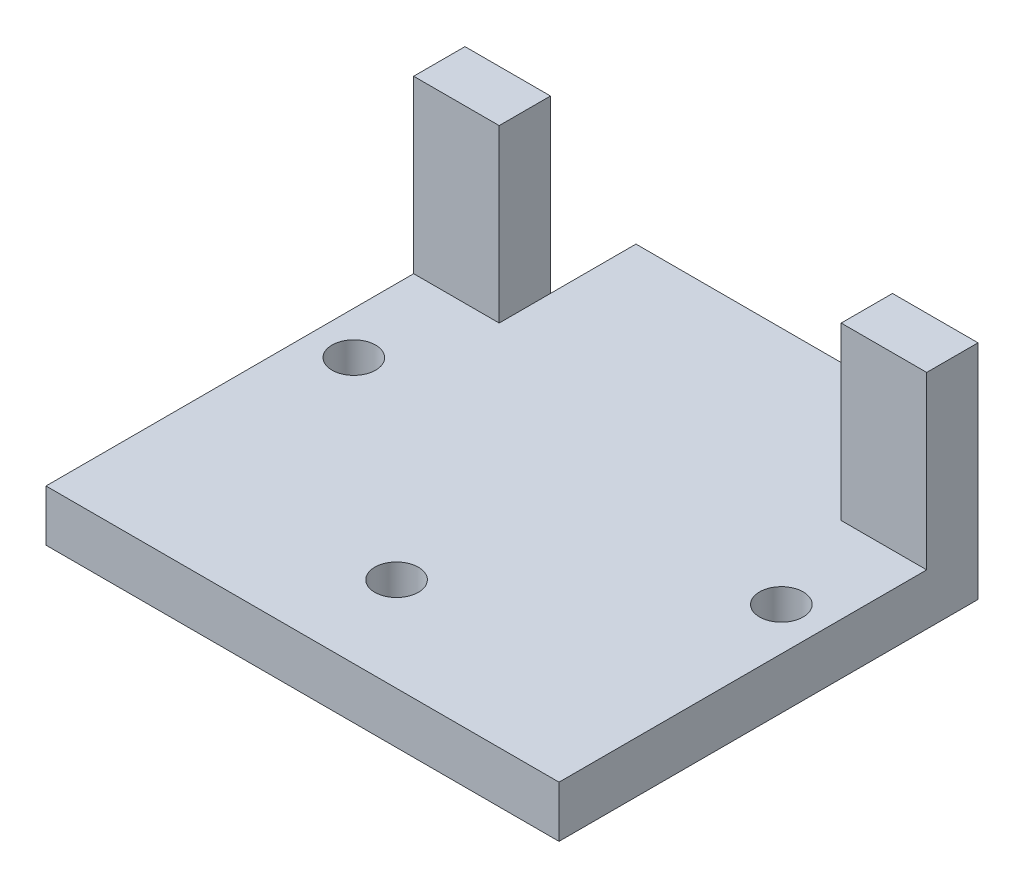
ISO-10303-21;
HEADER;
FILE_DESCRIPTION(('STEP AP214'),'2;1');
FILE_NAME('part.step','',(''),(''),'','','');
FILE_SCHEMA(('AUTOMOTIVE_DESIGN { 1 0 10303 214 1 1 1 1 }'));
ENDSEC;
DATA;
#1=APPLICATION_CONTEXT('core data for automotive mechanical design processes');
#2=APPLICATION_PROTOCOL_DEFINITION('international standard','automotive_design',2000,#1);
#3=PRODUCT_CONTEXT('',#1,'mechanical');
#4=PRODUCT('Part','Part','',(#3));
#5=PRODUCT_RELATED_PRODUCT_CATEGORY('part','',(#4));
#6=PRODUCT_DEFINITION_FORMATION('','',#4);
#7=PRODUCT_DEFINITION_CONTEXT('part definition',#1,'design');
#8=PRODUCT_DEFINITION('design','',#6,#7);
#9=PRODUCT_DEFINITION_SHAPE('','',#8);
#10=(LENGTH_UNIT() NAMED_UNIT(*) SI_UNIT(.MILLI.,.METRE.));
#11=(NAMED_UNIT(*) PLANE_ANGLE_UNIT() SI_UNIT($,.RADIAN.));
#12=(NAMED_UNIT(*) SI_UNIT($,.STERADIAN.) SOLID_ANGLE_UNIT());
#13=UNCERTAINTY_MEASURE_WITH_UNIT(LENGTH_MEASURE(1.E-05),#10,'distance_accuracy_value','');
#14=(GEOMETRIC_REPRESENTATION_CONTEXT(3) GLOBAL_UNCERTAINTY_ASSIGNED_CONTEXT((#13)) GLOBAL_UNIT_ASSIGNED_CONTEXT((#10,
#11,#12)) REPRESENTATION_CONTEXT('',''));
#15=CARTESIAN_POINT('',(0.,0.,0.));
#16=DIRECTION('',(0.,0.,1.));
#17=DIRECTION('',(1.,0.,0.));
#18=AXIS2_PLACEMENT_3D('',#15,#16,#17);
#19=CARTESIAN_POINT('',(0.,6.,0.));
#20=DIRECTION('',(0.,-1.,0.));
#21=DIRECTION('',(0.,0.,-1.));
#22=AXIS2_PLACEMENT_3D('',#19,#20,#21);
#23=PLANE('',#22);
#24=CARTESIAN_POINT('',(0.,6.,29.));
#25=DIRECTION('',(0.,1.,0.));
#26=DIRECTION('',(0.,0.,1.));
#27=AXIS2_PLACEMENT_3D('',#24,#25,#26);
#28=CIRCLE('',#27,2.55);
#29=CARTESIAN_POINT('',(0.,6.,31.55));
#30=VERTEX_POINT('',#29);
#31=EDGE_CURVE('E191',#30,#30,#28,.T.);
#32=ORIENTED_EDGE('',*,*,#31,.F.);
#33=EDGE_LOOP('',(#32));
#34=FACE_BOUND('',#33,.T.);
#35=CARTESIAN_POINT('',(-25.,6.,9.));
#36=DIRECTION('',(0.,1.,0.));
#37=DIRECTION('',(0.,0.,1.));
#38=AXIS2_PLACEMENT_3D('',#35,#36,#37);
#39=CIRCLE('',#38,2.55);
#40=CARTESIAN_POINT('',(-25.,6.,11.55));
#41=VERTEX_POINT('',#40);
#42=EDGE_CURVE('E465',#41,#41,#39,.T.);
#43=ORIENTED_EDGE('',*,*,#42,.F.);
#44=EDGE_LOOP('',(#43));
#45=FACE_BOUND('',#44,.T.);
#46=CARTESIAN_POINT('',(25.,6.,9.));
#47=DIRECTION('',(0.,1.,0.));
#48=DIRECTION('',(0.,0.,1.));
#49=AXIS2_PLACEMENT_3D('',#46,#47,#48);
#50=CIRCLE('',#49,2.55);
#51=CARTESIAN_POINT('',(25.,6.,11.55));
#52=VERTEX_POINT('',#51);
#53=EDGE_CURVE('E222',#52,#52,#50,.T.);
#54=ORIENTED_EDGE('',*,*,#53,.F.);
#55=EDGE_LOOP('',(#54));
#56=FACE_BOUND('',#55,.T.);
#57=DIRECTION('',(0.,0.,-1.));
#58=VECTOR('',#57,1.);
#59=CARTESIAN_POINT('',(-20.,6.,-3.));
#60=LINE('',#59,#58);
#61=CARTESIAN_POINT('',(-20.,6.,-3.));
#62=VERTEX_POINT('',#61);
#63=CARTESIAN_POINT('',(-20.,6.,-9.));
#64=VERTEX_POINT('',#63);
#65=EDGE_CURVE('E156',#62,#64,#60,.T.);
#66=ORIENTED_EDGE('',*,*,#65,.F.);
#67=DIRECTION('',(1.,0.,0.));
#68=VECTOR('',#67,1.);
#69=CARTESIAN_POINT('',(-30.,6.,-3.));
#70=LINE('',#69,#68);
#71=CARTESIAN_POINT('',(-30.,6.,-3.));
#72=VERTEX_POINT('',#71);
#73=EDGE_CURVE('E152',#72,#62,#70,.T.);
#74=ORIENTED_EDGE('',*,*,#73,.F.);
#75=DIRECTION('',(0.,0.,1.));
#76=VECTOR('',#75,1.);
#77=CARTESIAN_POINT('',(-30.,6.,40.));
#78=LINE('',#77,#76);
#79=CARTESIAN_POINT('',(-30.,6.,40.));
#80=VERTEX_POINT('',#79);
#81=EDGE_CURVE('E237',#72,#80,#78,.T.);
#82=ORIENTED_EDGE('',*,*,#81,.T.);
#83=DIRECTION('',(1.,0.,0.));
#84=VECTOR('',#83,1.);
#85=CARTESIAN_POINT('',(-30.,6.,40.));
#86=LINE('',#85,#84);
#87=CARTESIAN_POINT('',(30.,6.,40.));
#88=VERTEX_POINT('',#87);
#89=EDGE_CURVE('E239',#80,#88,#86,.T.);
#90=ORIENTED_EDGE('',*,*,#89,.T.);
#91=DIRECTION('',(0.,0.,-1.));
#92=VECTOR('',#91,1.);
#93=CARTESIAN_POINT('',(30.,6.,40.));
#94=LINE('',#93,#92);
#95=CARTESIAN_POINT('',(30.,6.,-3.));
#96=VERTEX_POINT('',#95);
#97=EDGE_CURVE('E182',#88,#96,#94,.T.);
#98=ORIENTED_EDGE('',*,*,#97,.T.);
#99=DIRECTION('',(1.,0.,0.));
#100=VECTOR('',#99,1.);
#101=CARTESIAN_POINT('',(30.,6.,-3.));
#102=LINE('',#101,#100);
#103=CARTESIAN_POINT('',(20.,6.,-3.));
#104=VERTEX_POINT('',#103);
#105=EDGE_CURVE('E52',#104,#96,#102,.T.);
#106=ORIENTED_EDGE('',*,*,#105,.F.);
#107=DIRECTION('',(0.,0.,1.));
#108=VECTOR('',#107,1.);
#109=CARTESIAN_POINT('',(20.,6.,-3.));
#110=LINE('',#109,#108);
#111=CARTESIAN_POINT('',(20.,6.,-9.));
#112=VERTEX_POINT('',#111);
#113=EDGE_CURVE('E157',#112,#104,#110,.T.);
#114=ORIENTED_EDGE('',*,*,#113,.F.);
#115=DIRECTION('',(0.,0.,1.));
#116=VECTOR('',#115,1.);
#117=CARTESIAN_POINT('',(20.,6.,-9.));
#118=LINE('',#117,#116);
#119=CARTESIAN_POINT('',(20.,6.,-19.));
#120=VERTEX_POINT('',#119);
#121=EDGE_CURVE('E210',#120,#112,#118,.T.);
#122=ORIENTED_EDGE('',*,*,#121,.F.);
#123=DIRECTION('',(1.,0.,0.));
#124=VECTOR('',#123,1.);
#125=CARTESIAN_POINT('',(-20.,6.,-19.));
#126=LINE('',#125,#124);
#127=CARTESIAN_POINT('',(-20.,6.,-19.));
#128=VERTEX_POINT('',#127);
#129=EDGE_CURVE('E219',#128,#120,#126,.T.);
#130=ORIENTED_EDGE('',*,*,#129,.F.);
#131=DIRECTION('',(0.,0.,-1.));
#132=VECTOR('',#131,1.);
#133=CARTESIAN_POINT('',(-20.,6.,-9.));
#134=LINE('',#133,#132);
#135=EDGE_CURVE('E215',#64,#128,#134,.T.);
#136=ORIENTED_EDGE('',*,*,#135,.F.);
#137=EDGE_LOOP('',(#66,#74,#82,#90,#98,#106,#114,#122,#130,#136));
#138=FACE_BOUND('',#137,.T.);
#139=ADVANCED_FACE('F35',(#34,#45,#56,#138),#23,.F.);
#140=CARTESIAN_POINT('',(30.,6.,40.));
#141=DIRECTION('',(-1.,0.,0.));
#142=DIRECTION('',(0.,0.,1.));
#143=AXIS2_PLACEMENT_3D('',#140,#141,#142);
#144=PLANE('',#143);
#145=DIRECTION('',(0.,0.,-1.));
#146=VECTOR('',#145,1.);
#147=CARTESIAN_POINT('',(30.,0.,40.));
#148=LINE('',#147,#146);
#149=CARTESIAN_POINT('',(30.,0.,40.));
#150=VERTEX_POINT('',#149);
#151=CARTESIAN_POINT('',(30.,0.,-9.));
#152=VERTEX_POINT('',#151);
#153=EDGE_CURVE('E234',#150,#152,#148,.T.);
#154=ORIENTED_EDGE('',*,*,#153,.T.);
#155=DIRECTION('',(0.,1.,0.));
#156=VECTOR('',#155,1.);
#157=CARTESIAN_POINT('',(30.,6.,-9.));
#158=LINE('',#157,#156);
#159=CARTESIAN_POINT('',(30.,26.,-9.));
#160=VERTEX_POINT('',#159);
#161=EDGE_CURVE('E60',#152,#160,#158,.T.);
#162=ORIENTED_EDGE('',*,*,#161,.T.);
#163=DIRECTION('',(0.,0.,-1.));
#164=VECTOR('',#163,1.);
#165=CARTESIAN_POINT('',(30.,26.,-3.));
#166=LINE('',#165,#164);
#167=CARTESIAN_POINT('',(30.,26.,-3.));
#168=VERTEX_POINT('',#167);
#169=EDGE_CURVE('E171',#168,#160,#166,.T.);
#170=ORIENTED_EDGE('',*,*,#169,.F.);
#171=DIRECTION('',(0.,-1.,0.));
#172=VECTOR('',#171,1.);
#173=CARTESIAN_POINT('',(30.,26.,-3.));
#174=LINE('',#173,#172);
#175=EDGE_CURVE('E184',#168,#96,#174,.T.);
#176=ORIENTED_EDGE('',*,*,#175,.T.);
#177=ORIENTED_EDGE('',*,*,#97,.F.);
#178=DIRECTION('',(0.,-1.,0.));
#179=VECTOR('',#178,1.);
#180=CARTESIAN_POINT('',(30.,6.,40.));
#181=LINE('',#180,#179);
#182=EDGE_CURVE('E241',#88,#150,#181,.T.);
#183=ORIENTED_EDGE('',*,*,#182,.T.);
#184=EDGE_LOOP('',(#154,#162,#170,#176,#177,#183));
#185=FACE_BOUND('',#184,.T.);
#186=ADVANCED_FACE('F37',(#185),#144,.F.);
#187=CARTESIAN_POINT('',(-30.,6.,40.));
#188=DIRECTION('',(1.,0.,0.));
#189=DIRECTION('',(0.,0.,-1.));
#190=AXIS2_PLACEMENT_3D('',#187,#188,#189);
#191=PLANE('',#190);
#192=ORIENTED_EDGE('',*,*,#81,.F.);
#193=DIRECTION('',(0.,-1.,0.));
#194=VECTOR('',#193,1.);
#195=CARTESIAN_POINT('',(-30.,26.,-3.));
#196=LINE('',#195,#194);
#197=CARTESIAN_POINT('',(-30.,26.,-3.));
#198=VERTEX_POINT('',#197);
#199=EDGE_CURVE('E158',#198,#72,#196,.T.);
#200=ORIENTED_EDGE('',*,*,#199,.F.);
#201=DIRECTION('',(0.,0.,1.));
#202=VECTOR('',#201,1.);
#203=CARTESIAN_POINT('',(-30.,26.,-3.));
#204=LINE('',#203,#202);
#205=CARTESIAN_POINT('',(-30.,26.,-9.));
#206=VERTEX_POINT('',#205);
#207=EDGE_CURVE('E142',#206,#198,#204,.T.);
#208=ORIENTED_EDGE('',*,*,#207,.F.);
#209=DIRECTION('',(0.,-1.,0.));
#210=VECTOR('',#209,1.);
#211=CARTESIAN_POINT('',(-30.,6.,-9.));
#212=LINE('',#211,#210);
#213=CARTESIAN_POINT('',(-30.,0.,-9.));
#214=VERTEX_POINT('',#213);
#215=EDGE_CURVE('E139',#206,#214,#212,.T.);
#216=ORIENTED_EDGE('',*,*,#215,.T.);
#217=DIRECTION('',(0.,0.,1.));
#218=VECTOR('',#217,1.);
#219=CARTESIAN_POINT('',(-30.,0.,40.));
#220=LINE('',#219,#218);
#221=CARTESIAN_POINT('',(-30.,0.,40.));
#222=VERTEX_POINT('',#221);
#223=EDGE_CURVE('E244',#214,#222,#220,.T.);
#224=ORIENTED_EDGE('',*,*,#223,.T.);
#225=DIRECTION('',(0.,-1.,0.));
#226=VECTOR('',#225,1.);
#227=CARTESIAN_POINT('',(-30.,6.,40.));
#228=LINE('',#227,#226);
#229=EDGE_CURVE('E44',#80,#222,#228,.T.);
#230=ORIENTED_EDGE('',*,*,#229,.F.);
#231=EDGE_LOOP('',(#192,#200,#208,#216,#224,#230));
#232=FACE_BOUND('',#231,.T.);
#233=ADVANCED_FACE('F283',(#232),#191,.F.);
#234=CARTESIAN_POINT('',(-30.,6.,40.));
#235=DIRECTION('',(0.,0.,-1.));
#236=DIRECTION('',(-1.,0.,0.));
#237=AXIS2_PLACEMENT_3D('',#234,#235,#236);
#238=PLANE('',#237);
#239=DIRECTION('',(1.,0.,0.));
#240=VECTOR('',#239,1.);
#241=CARTESIAN_POINT('',(-30.,0.,40.));
#242=LINE('',#241,#240);
#243=EDGE_CURVE('E246',#222,#150,#242,.T.);
#244=ORIENTED_EDGE('',*,*,#243,.T.);
#245=ORIENTED_EDGE('',*,*,#182,.F.);
#246=ORIENTED_EDGE('',*,*,#89,.F.);
#247=ORIENTED_EDGE('',*,*,#229,.T.);
#248=EDGE_LOOP('',(#244,#245,#246,#247));
#249=FACE_BOUND('',#248,.T.);
#250=ADVANCED_FACE('F255',(#249),#238,.F.);
#251=CARTESIAN_POINT('',(0.,0.,0.));
#252=DIRECTION('',(0.,-1.,0.));
#253=DIRECTION('',(0.,0.,-1.));
#254=AXIS2_PLACEMENT_3D('',#251,#252,#253);
#255=PLANE('',#254);
#256=CARTESIAN_POINT('',(0.,0.,29.));
#257=DIRECTION('',(0.,1.,0.));
#258=DIRECTION('',(0.,0.,1.));
#259=AXIS2_PLACEMENT_3D('',#256,#257,#258);
#260=CIRCLE('',#259,2.55);
#261=CARTESIAN_POINT('',(0.,0.,31.55));
#262=VERTEX_POINT('',#261);
#263=EDGE_CURVE('E468',#262,#262,#260,.T.);
#264=ORIENTED_EDGE('',*,*,#263,.T.);
#265=EDGE_LOOP('',(#264));
#266=FACE_BOUND('',#265,.T.);
#267=CARTESIAN_POINT('',(-25.,0.,9.));
#268=DIRECTION('',(0.,1.,0.));
#269=DIRECTION('',(0.,0.,1.));
#270=AXIS2_PLACEMENT_3D('',#267,#268,#269);
#271=CIRCLE('',#270,2.55);
#272=CARTESIAN_POINT('',(-25.,0.,11.55));
#273=VERTEX_POINT('',#272);
#274=EDGE_CURVE('E463',#273,#273,#271,.T.);
#275=ORIENTED_EDGE('',*,*,#274,.T.);
#276=EDGE_LOOP('',(#275));
#277=FACE_BOUND('',#276,.T.);
#278=CARTESIAN_POINT('',(25.,0.,9.));
#279=DIRECTION('',(0.,1.,0.));
#280=DIRECTION('',(0.,0.,1.));
#281=AXIS2_PLACEMENT_3D('',#278,#279,#280);
#282=CIRCLE('',#281,2.55);
#283=CARTESIAN_POINT('',(25.,0.,11.55));
#284=VERTEX_POINT('',#283);
#285=EDGE_CURVE('E216',#284,#284,#282,.T.);
#286=ORIENTED_EDGE('',*,*,#285,.T.);
#287=EDGE_LOOP('',(#286));
#288=FACE_BOUND('',#287,.T.);
#289=DIRECTION('',(-1.,0.,0.));
#290=VECTOR('',#289,1.);
#291=CARTESIAN_POINT('',(0.,0.,-9.));
#292=LINE('',#291,#290);
#293=CARTESIAN_POINT('',(-20.,0.,-9.));
#294=VERTEX_POINT('',#293);
#295=EDGE_CURVE('E11',#294,#214,#292,.T.);
#296=ORIENTED_EDGE('',*,*,#295,.F.);
#297=DIRECTION('',(0.,0.,-1.));
#298=VECTOR('',#297,1.);
#299=CARTESIAN_POINT('',(-20.,0.,-9.));
#300=LINE('',#299,#298);
#301=CARTESIAN_POINT('',(-20.,0.,-19.));
#302=VERTEX_POINT('',#301);
#303=EDGE_CURVE('E457',#294,#302,#300,.T.);
#304=ORIENTED_EDGE('',*,*,#303,.T.);
#305=DIRECTION('',(1.,0.,0.));
#306=VECTOR('',#305,1.);
#307=CARTESIAN_POINT('',(-20.,0.,-19.));
#308=LINE('',#307,#306);
#309=CARTESIAN_POINT('',(20.,0.,-19.));
#310=VERTEX_POINT('',#309);
#311=EDGE_CURVE('E207',#302,#310,#308,.T.);
#312=ORIENTED_EDGE('',*,*,#311,.T.);
#313=DIRECTION('',(0.,0.,1.));
#314=VECTOR('',#313,1.);
#315=CARTESIAN_POINT('',(20.,0.,-9.));
#316=LINE('',#315,#314);
#317=CARTESIAN_POINT('',(20.,0.,-9.));
#318=VERTEX_POINT('',#317);
#319=EDGE_CURVE('E228',#310,#318,#316,.T.);
#320=ORIENTED_EDGE('',*,*,#319,.T.);
#321=DIRECTION('',(1.,0.,0.));
#322=VECTOR('',#321,1.);
#323=CARTESIAN_POINT('',(20.,0.,-9.));
#324=LINE('',#323,#322);
#325=EDGE_CURVE('E202',#318,#152,#324,.T.);
#326=ORIENTED_EDGE('',*,*,#325,.T.);
#327=ORIENTED_EDGE('',*,*,#153,.F.);
#328=ORIENTED_EDGE('',*,*,#243,.F.);
#329=ORIENTED_EDGE('',*,*,#223,.F.);
#330=EDGE_LOOP('',(#296,#304,#312,#320,#326,#327,#328,#329));
#331=FACE_BOUND('',#330,.T.);
#332=ADVANCED_FACE('F263',(#266,#277,#288,#331),#255,.T.);
#333=CARTESIAN_POINT('',(-38.8916061845162,0.,-9.));
#334=DIRECTION('',(0.,0.,1.));
#335=DIRECTION('',(1.,0.,0.));
#336=AXIS2_PLACEMENT_3D('',#333,#334,#335);
#337=PLANE('',#336);
#338=ORIENTED_EDGE('',*,*,#215,.F.);
#339=DIRECTION('',(-1.,0.,0.));
#340=VECTOR('',#339,1.);
#341=CARTESIAN_POINT('',(-30.,26.,-9.));
#342=LINE('',#341,#340);
#343=CARTESIAN_POINT('',(-20.,26.,-9.));
#344=VERTEX_POINT('',#343);
#345=EDGE_CURVE('E132',#344,#206,#342,.T.);
#346=ORIENTED_EDGE('',*,*,#345,.F.);
#347=DIRECTION('',(0.,-1.,0.));
#348=VECTOR('',#347,1.);
#349=CARTESIAN_POINT('',(-20.,26.,-9.));
#350=LINE('',#349,#348);
#351=EDGE_CURVE('E136',#344,#64,#350,.T.);
#352=ORIENTED_EDGE('',*,*,#351,.T.);
#353=DIRECTION('',(0.,1.,0.));
#354=VECTOR('',#353,1.);
#355=CARTESIAN_POINT('',(-20.,0.,-9.));
#356=LINE('',#355,#354);
#357=EDGE_CURVE('E206',#294,#64,#356,.T.);
#358=ORIENTED_EDGE('',*,*,#357,.F.);
#359=ORIENTED_EDGE('',*,*,#295,.T.);
#360=EDGE_LOOP('',(#338,#346,#352,#358,#359));
#361=FACE_BOUND('',#360,.T.);
#362=ADVANCED_FACE('F134',(#361),#337,.F.);
#363=CARTESIAN_POINT('',(20.,0.,-9.));
#364=DIRECTION('',(0.,0.,1.));
#365=DIRECTION('',(1.,0.,0.));
#366=AXIS2_PLACEMENT_3D('',#363,#364,#365);
#367=PLANE('',#366);
#368=ORIENTED_EDGE('',*,*,#325,.F.);
#369=DIRECTION('',(0.,1.,0.));
#370=VECTOR('',#369,1.);
#371=CARTESIAN_POINT('',(20.,0.,-9.));
#372=LINE('',#371,#370);
#373=EDGE_CURVE('E200',#318,#112,#372,.T.);
#374=ORIENTED_EDGE('',*,*,#373,.T.);
#375=DIRECTION('',(0.,-1.,0.));
#376=VECTOR('',#375,1.);
#377=CARTESIAN_POINT('',(20.,26.,-9.));
#378=LINE('',#377,#376);
#379=CARTESIAN_POINT('',(20.,26.,-9.));
#380=VERTEX_POINT('',#379);
#381=EDGE_CURVE('E175',#380,#112,#378,.T.);
#382=ORIENTED_EDGE('',*,*,#381,.F.);
#383=DIRECTION('',(-1.,0.,0.));
#384=VECTOR('',#383,1.);
#385=CARTESIAN_POINT('',(30.,26.,-9.));
#386=LINE('',#385,#384);
#387=EDGE_CURVE('E174',#160,#380,#386,.T.);
#388=ORIENTED_EDGE('',*,*,#387,.F.);
#389=ORIENTED_EDGE('',*,*,#161,.F.);
#390=EDGE_LOOP('',(#368,#374,#382,#388,#389));
#391=FACE_BOUND('',#390,.T.);
#392=ADVANCED_FACE('F199',(#391),#367,.F.);
#393=CARTESIAN_POINT('',(20.,0.,-9.));
#394=DIRECTION('',(-1.,0.,0.));
#395=DIRECTION('',(0.,0.,1.));
#396=AXIS2_PLACEMENT_3D('',#393,#394,#395);
#397=PLANE('',#396);
#398=ORIENTED_EDGE('',*,*,#121,.T.);
#399=ORIENTED_EDGE('',*,*,#373,.F.);
#400=ORIENTED_EDGE('',*,*,#319,.F.);
#401=DIRECTION('',(0.,1.,0.));
#402=VECTOR('',#401,1.);
#403=CARTESIAN_POINT('',(20.,0.,-19.));
#404=LINE('',#403,#402);
#405=EDGE_CURVE('E212',#310,#120,#404,.T.);
#406=ORIENTED_EDGE('',*,*,#405,.T.);
#407=EDGE_LOOP('',(#398,#399,#400,#406));
#408=FACE_BOUND('',#407,.T.);
#409=ADVANCED_FACE('F211',(#408),#397,.F.);
#410=CARTESIAN_POINT('',(-20.,0.,-19.));
#411=DIRECTION('',(0.,0.,1.));
#412=DIRECTION('',(1.,0.,0.));
#413=AXIS2_PLACEMENT_3D('',#410,#411,#412);
#414=PLANE('',#413);
#415=ORIENTED_EDGE('',*,*,#129,.T.);
#416=ORIENTED_EDGE('',*,*,#405,.F.);
#417=ORIENTED_EDGE('',*,*,#311,.F.);
#418=DIRECTION('',(0.,1.,0.));
#419=VECTOR('',#418,1.);
#420=CARTESIAN_POINT('',(-20.,0.,-19.));
#421=LINE('',#420,#419);
#422=EDGE_CURVE('E230',#302,#128,#421,.T.);
#423=ORIENTED_EDGE('',*,*,#422,.T.);
#424=EDGE_LOOP('',(#415,#416,#417,#423));
#425=FACE_BOUND('',#424,.T.);
#426=ADVANCED_FACE('F354',(#425),#414,.F.);
#427=CARTESIAN_POINT('',(-20.,0.,-9.));
#428=DIRECTION('',(1.,0.,0.));
#429=DIRECTION('',(0.,0.,-1.));
#430=AXIS2_PLACEMENT_3D('',#427,#428,#429);
#431=PLANE('',#430);
#432=ORIENTED_EDGE('',*,*,#135,.T.);
#433=ORIENTED_EDGE('',*,*,#422,.F.);
#434=ORIENTED_EDGE('',*,*,#303,.F.);
#435=ORIENTED_EDGE('',*,*,#357,.T.);
#436=EDGE_LOOP('',(#432,#433,#434,#435));
#437=FACE_BOUND('',#436,.T.);
#438=ADVANCED_FACE('F348',(#437),#431,.F.);
#439=CARTESIAN_POINT('',(25.,0.,9.));
#440=DIRECTION('',(0.,1.,0.));
#441=DIRECTION('',(0.,0.,1.));
#442=AXIS2_PLACEMENT_3D('',#439,#440,#441);
#443=CYLINDRICAL_SURFACE('',#442,2.55);
#444=ORIENTED_EDGE('',*,*,#285,.F.);
#445=EDGE_LOOP('',(#444));
#446=FACE_BOUND('',#445,.T.);
#447=ORIENTED_EDGE('',*,*,#53,.T.);
#448=EDGE_LOOP('',(#447));
#449=FACE_BOUND('',#448,.T.);
#450=ADVANCED_FACE('F353',(#446,#449),#443,.F.);
#451=CARTESIAN_POINT('',(-25.,0.,9.));
#452=DIRECTION('',(0.,1.,0.));
#453=DIRECTION('',(0.,0.,1.));
#454=AXIS2_PLACEMENT_3D('',#451,#452,#453);
#455=CYLINDRICAL_SURFACE('',#454,2.55);
#456=ORIENTED_EDGE('',*,*,#274,.F.);
#457=EDGE_LOOP('',(#456));
#458=FACE_BOUND('',#457,.T.);
#459=ORIENTED_EDGE('',*,*,#42,.T.);
#460=EDGE_LOOP('',(#459));
#461=FACE_BOUND('',#460,.T.);
#462=ADVANCED_FACE('F406',(#458,#461),#455,.F.);
#463=CARTESIAN_POINT('',(0.,0.,29.));
#464=DIRECTION('',(0.,1.,0.));
#465=DIRECTION('',(0.,0.,1.));
#466=AXIS2_PLACEMENT_3D('',#463,#464,#465);
#467=CYLINDRICAL_SURFACE('',#466,2.55);
#468=ORIENTED_EDGE('',*,*,#263,.F.);
#469=EDGE_LOOP('',(#468));
#470=FACE_BOUND('',#469,.T.);
#471=ORIENTED_EDGE('',*,*,#31,.T.);
#472=EDGE_LOOP('',(#471));
#473=FACE_BOUND('',#472,.T.);
#474=ADVANCED_FACE('F341',(#470,#473),#467,.F.);
#475=CARTESIAN_POINT('',(20.,26.,-3.));
#476=DIRECTION('',(1.,0.,0.));
#477=DIRECTION('',(0.,0.,-1.));
#478=AXIS2_PLACEMENT_3D('',#475,#476,#477);
#479=PLANE('',#478);
#480=ORIENTED_EDGE('',*,*,#113,.T.);
#481=DIRECTION('',(0.,-1.,0.));
#482=VECTOR('',#481,1.);
#483=CARTESIAN_POINT('',(20.,26.,-3.));
#484=LINE('',#483,#482);
#485=CARTESIAN_POINT('',(20.,26.,-3.));
#486=VERTEX_POINT('',#485);
#487=EDGE_CURVE('E186',#486,#104,#484,.T.);
#488=ORIENTED_EDGE('',*,*,#487,.F.);
#489=DIRECTION('',(0.,0.,1.));
#490=VECTOR('',#489,1.);
#491=CARTESIAN_POINT('',(20.,26.,-3.));
#492=LINE('',#491,#490);
#493=EDGE_CURVE('E166',#380,#486,#492,.T.);
#494=ORIENTED_EDGE('',*,*,#493,.F.);
#495=ORIENTED_EDGE('',*,*,#381,.T.);
#496=EDGE_LOOP('',(#480,#488,#494,#495));
#497=FACE_BOUND('',#496,.T.);
#498=ADVANCED_FACE('F196',(#497),#479,.F.);
#499=CARTESIAN_POINT('',(30.,26.,-3.));
#500=DIRECTION('',(0.,0.,-1.));
#501=DIRECTION('',(-1.,0.,0.));
#502=AXIS2_PLACEMENT_3D('',#499,#500,#501);
#503=PLANE('',#502);
#504=ORIENTED_EDGE('',*,*,#105,.T.);
#505=ORIENTED_EDGE('',*,*,#175,.F.);
#506=DIRECTION('',(1.,0.,0.));
#507=VECTOR('',#506,1.);
#508=CARTESIAN_POINT('',(30.,26.,-3.));
#509=LINE('',#508,#507);
#510=EDGE_CURVE('E169',#486,#168,#509,.T.);
#511=ORIENTED_EDGE('',*,*,#510,.F.);
#512=ORIENTED_EDGE('',*,*,#487,.T.);
#513=EDGE_LOOP('',(#504,#505,#511,#512));
#514=FACE_BOUND('',#513,.T.);
#515=ADVANCED_FACE('F265',(#514),#503,.F.);
#516=CARTESIAN_POINT('',(0.,26.,0.));
#517=DIRECTION('',(0.,1.,0.));
#518=DIRECTION('',(0.,0.,1.));
#519=AXIS2_PLACEMENT_3D('',#516,#517,#518);
#520=PLANE('',#519);
#521=ORIENTED_EDGE('',*,*,#493,.T.);
#522=ORIENTED_EDGE('',*,*,#510,.T.);
#523=ORIENTED_EDGE('',*,*,#169,.T.);
#524=ORIENTED_EDGE('',*,*,#387,.T.);
#525=EDGE_LOOP('',(#521,#522,#523,#524));
#526=FACE_BOUND('',#525,.T.);
#527=ADVANCED_FACE('F267',(#526),#520,.T.);
#528=CARTESIAN_POINT('',(-20.,26.,-3.));
#529=DIRECTION('',(-1.,0.,0.));
#530=DIRECTION('',(0.,0.,1.));
#531=AXIS2_PLACEMENT_3D('',#528,#529,#530);
#532=PLANE('',#531);
#533=ORIENTED_EDGE('',*,*,#65,.T.);
#534=ORIENTED_EDGE('',*,*,#351,.F.);
#535=DIRECTION('',(0.,0.,-1.));
#536=VECTOR('',#535,1.);
#537=CARTESIAN_POINT('',(-20.,26.,-3.));
#538=LINE('',#537,#536);
#539=CARTESIAN_POINT('',(-20.,26.,-3.));
#540=VERTEX_POINT('',#539);
#541=EDGE_CURVE('E143',#540,#344,#538,.T.);
#542=ORIENTED_EDGE('',*,*,#541,.F.);
#543=DIRECTION('',(0.,-1.,0.));
#544=VECTOR('',#543,1.);
#545=CARTESIAN_POINT('',(-20.,26.,-3.));
#546=LINE('',#545,#544);
#547=EDGE_CURVE('E162',#540,#62,#546,.T.);
#548=ORIENTED_EDGE('',*,*,#547,.T.);
#549=EDGE_LOOP('',(#533,#534,#542,#548));
#550=FACE_BOUND('',#549,.T.);
#551=ADVANCED_FACE('F154',(#550),#532,.F.);
#552=CARTESIAN_POINT('',(-30.,26.,-3.));
#553=DIRECTION('',(0.,0.,-1.));
#554=DIRECTION('',(-1.,0.,0.));
#555=AXIS2_PLACEMENT_3D('',#552,#553,#554);
#556=PLANE('',#555);
#557=ORIENTED_EDGE('',*,*,#73,.T.);
#558=ORIENTED_EDGE('',*,*,#547,.F.);
#559=DIRECTION('',(1.,0.,0.));
#560=VECTOR('',#559,1.);
#561=CARTESIAN_POINT('',(-30.,26.,-3.));
#562=LINE('',#561,#560);
#563=EDGE_CURVE('E148',#198,#540,#562,.T.);
#564=ORIENTED_EDGE('',*,*,#563,.F.);
#565=ORIENTED_EDGE('',*,*,#199,.T.);
#566=EDGE_LOOP('',(#557,#558,#564,#565));
#567=FACE_BOUND('',#566,.T.);
#568=ADVANCED_FACE('F274',(#567),#556,.F.);
#569=CARTESIAN_POINT('',(0.,26.,0.));
#570=DIRECTION('',(0.,-1.,0.));
#571=DIRECTION('',(0.,0.,-1.));
#572=AXIS2_PLACEMENT_3D('',#569,#570,#571);
#573=PLANE('',#572);
#574=ORIENTED_EDGE('',*,*,#541,.T.);
#575=ORIENTED_EDGE('',*,*,#345,.T.);
#576=ORIENTED_EDGE('',*,*,#207,.T.);
#577=ORIENTED_EDGE('',*,*,#563,.T.);
#578=EDGE_LOOP('',(#574,#575,#576,#577));
#579=FACE_BOUND('',#578,.T.);
#580=ADVANCED_FACE('F146',(#579),#573,.F.);
#581=CLOSED_SHELL('',(#139,#186,#233,#250,#332,#362,#392,#409,#426,#438,#450,#462,#474,#498,
#515,#527,#551,#568,#580));
#582=MANIFOLD_SOLID_BREP('B2',#581);
#583=ADVANCED_BREP_SHAPE_REPRESENTATION('',(#18,#582),#14);
#584=SHAPE_DEFINITION_REPRESENTATION(#9,#583);
ENDSEC;
END-ISO-10303-21;
